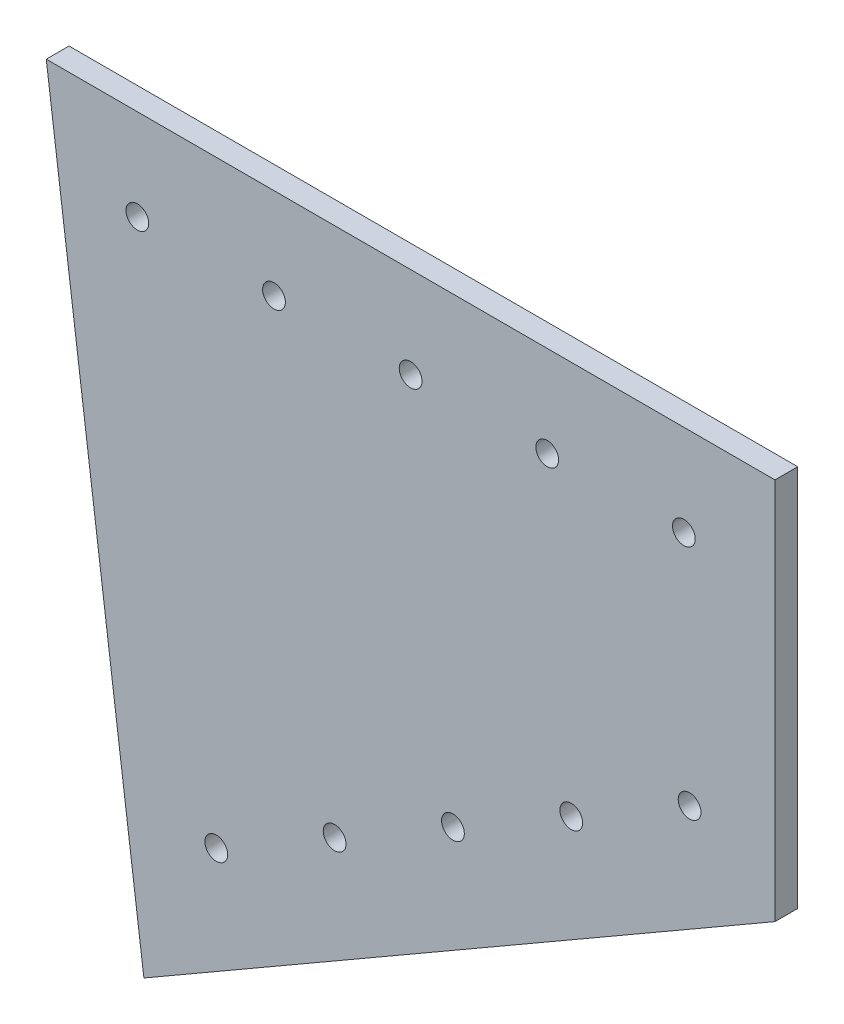
ISO-10303-21;
HEADER;
FILE_DESCRIPTION(('STEP AP214'),'2;1');
FILE_NAME('part.step','',(''),(''),'','','');
FILE_SCHEMA(('AUTOMOTIVE_DESIGN { 1 0 10303 214 1 1 1 1 }'));
ENDSEC;
DATA;
#1=APPLICATION_CONTEXT('core data for automotive mechanical design processes');
#2=APPLICATION_PROTOCOL_DEFINITION('international standard','automotive_design',2000,#1);
#3=PRODUCT_CONTEXT('',#1,'mechanical');
#4=PRODUCT('Part','Part','',(#3));
#5=PRODUCT_RELATED_PRODUCT_CATEGORY('part','',(#4));
#6=PRODUCT_DEFINITION_FORMATION('','',#4);
#7=PRODUCT_DEFINITION_CONTEXT('part definition',#1,'design');
#8=PRODUCT_DEFINITION('design','',#6,#7);
#9=PRODUCT_DEFINITION_SHAPE('','',#8);
#10=(LENGTH_UNIT() NAMED_UNIT(*) SI_UNIT(.MILLI.,.METRE.));
#11=(NAMED_UNIT(*) PLANE_ANGLE_UNIT() SI_UNIT($,.RADIAN.));
#12=(NAMED_UNIT(*) SI_UNIT($,.STERADIAN.) SOLID_ANGLE_UNIT());
#13=UNCERTAINTY_MEASURE_WITH_UNIT(LENGTH_MEASURE(1.E-05),#10,'distance_accuracy_value','');
#14=(GEOMETRIC_REPRESENTATION_CONTEXT(3) GLOBAL_UNCERTAINTY_ASSIGNED_CONTEXT((#13)) GLOBAL_UNIT_ASSIGNED_CONTEXT((#10,
#11,#12)) REPRESENTATION_CONTEXT('',''));
#15=CARTESIAN_POINT('',(0.,0.,0.));
#16=DIRECTION('',(0.,0.,1.));
#17=DIRECTION('',(1.,0.,0.));
#18=AXIS2_PLACEMENT_3D('',#15,#16,#17);
#19=CARTESIAN_POINT('',(0.,0.,3.175));
#20=DIRECTION('',(-0.500000000000001,0.866025403784438,0.));
#21=DIRECTION('',(-0.866025403784438,-0.500000000000001,0.));
#22=AXIS2_PLACEMENT_3D('',#19,#20,#21);
#23=PLANE('',#22);
#24=DIRECTION('',(0.866025403784438,0.500000000000001,0.));
#25=VECTOR('',#24,1.);
#26=CARTESIAN_POINT('',(0.,0.,0.));
#27=LINE('',#26,#25);
#28=CARTESIAN_POINT('',(-87.9881810244989,-50.8000000000001,0.));
#29=VERTEX_POINT('',#28);
#30=CARTESIAN_POINT('',(0.,0.,0.));
#31=VERTEX_POINT('',#30);
#32=EDGE_CURVE('E112',#29,#31,#27,.T.);
#33=ORIENTED_EDGE('',*,*,#32,.T.);
#34=DIRECTION('',(0.,0.,-1.));
#35=VECTOR('',#34,1.);
#36=CARTESIAN_POINT('',(0.,0.,3.175));
#37=LINE('',#36,#35);
#38=CARTESIAN_POINT('',(0.,0.,3.175));
#39=VERTEX_POINT('',#38);
#40=EDGE_CURVE('E11',#39,#31,#37,.T.);
#41=ORIENTED_EDGE('',*,*,#40,.F.);
#42=DIRECTION('',(0.866025403784438,0.500000000000001,0.));
#43=VECTOR('',#42,1.);
#44=CARTESIAN_POINT('',(0.,0.,3.175));
#45=LINE('',#44,#43);
#46=CARTESIAN_POINT('',(-87.9881810244989,-50.8000000000001,3.175));
#47=VERTEX_POINT('',#46);
#48=EDGE_CURVE('E95',#47,#39,#45,.T.);
#49=ORIENTED_EDGE('',*,*,#48,.F.);
#50=DIRECTION('',(0.,0.,-1.));
#51=VECTOR('',#50,1.);
#52=CARTESIAN_POINT('',(-87.9881810244989,-50.8000000000001,3.175));
#53=LINE('',#52,#51);
#54=EDGE_CURVE('E108',#47,#29,#53,.T.);
#55=ORIENTED_EDGE('',*,*,#54,.T.);
#56=EDGE_LOOP('',(#33,#41,#49,#55));
#57=FACE_BOUND('',#56,.T.);
#58=ADVANCED_FACE('F38',(#57),#23,.F.);
#59=CARTESIAN_POINT('',(0.,0.,3.175));
#60=DIRECTION('',(-1.,0.,0.));
#61=DIRECTION('',(0.,0.,1.));
#62=AXIS2_PLACEMENT_3D('',#59,#60,#61);
#63=PLANE('',#62);
#64=DIRECTION('',(0.,1.,0.));
#65=VECTOR('',#64,1.);
#66=CARTESIAN_POINT('',(0.,0.,0.));
#67=LINE('',#66,#65);
#68=CARTESIAN_POINT('',(0.,53.34,0.));
#69=VERTEX_POINT('',#68);
#70=EDGE_CURVE('E100',#31,#69,#67,.T.);
#71=ORIENTED_EDGE('',*,*,#70,.T.);
#72=DIRECTION('',(0.,0.,-1.));
#73=VECTOR('',#72,1.);
#74=CARTESIAN_POINT('',(0.,53.34,3.175));
#75=LINE('',#74,#73);
#76=CARTESIAN_POINT('',(0.,53.34,3.175));
#77=VERTEX_POINT('',#76);
#78=EDGE_CURVE('E47',#77,#69,#75,.T.);
#79=ORIENTED_EDGE('',*,*,#78,.F.);
#80=DIRECTION('',(0.,1.,0.));
#81=VECTOR('',#80,1.);
#82=CARTESIAN_POINT('',(0.,0.,3.175));
#83=LINE('',#82,#81);
#84=EDGE_CURVE('E90',#39,#77,#83,.T.);
#85=ORIENTED_EDGE('',*,*,#84,.F.);
#86=ORIENTED_EDGE('',*,*,#40,.T.);
#87=EDGE_LOOP('',(#71,#79,#85,#86));
#88=FACE_BOUND('',#87,.T.);
#89=ADVANCED_FACE('F99',(#88),#63,.F.);
#90=CARTESIAN_POINT('',(0.,53.34,3.175));
#91=DIRECTION('',(0.,-1.,0.));
#92=DIRECTION('',(1.,0.,0.));
#93=AXIS2_PLACEMENT_3D('',#90,#91,#92);
#94=PLANE('',#93);
#95=DIRECTION('',(-1.,0.,0.));
#96=VECTOR('',#95,1.);
#97=CARTESIAN_POINT('',(0.,53.34,0.));
#98=LINE('',#97,#96);
#99=CARTESIAN_POINT('',(-101.6,53.34,0.));
#100=VERTEX_POINT('',#99);
#101=EDGE_CURVE('E75',#69,#100,#98,.T.);
#102=ORIENTED_EDGE('',*,*,#101,.T.);
#103=DIRECTION('',(0.,0.,-1.));
#104=VECTOR('',#103,1.);
#105=CARTESIAN_POINT('',(-101.6,53.34,3.175));
#106=LINE('',#105,#104);
#107=CARTESIAN_POINT('',(-101.6,53.34,3.175));
#108=VERTEX_POINT('',#107);
#109=EDGE_CURVE('E102',#108,#100,#106,.T.);
#110=ORIENTED_EDGE('',*,*,#109,.F.);
#111=DIRECTION('',(-1.,0.,0.));
#112=VECTOR('',#111,1.);
#113=CARTESIAN_POINT('',(0.,53.34,3.175));
#114=LINE('',#113,#112);
#115=EDGE_CURVE('E93',#77,#108,#114,.T.);
#116=ORIENTED_EDGE('',*,*,#115,.F.);
#117=ORIENTED_EDGE('',*,*,#78,.T.);
#118=EDGE_LOOP('',(#102,#110,#116,#117));
#119=FACE_BOUND('',#118,.T.);
#120=ADVANCED_FACE('F103',(#119),#94,.F.);
#121=CARTESIAN_POINT('',(-87.9881810244989,-50.8000000000001,3.175));
#122=DIRECTION('',(0.991565767284408,0.129604510529856,0.));
#123=DIRECTION('',(-0.129604510529856,0.991565767284408,0.));
#124=AXIS2_PLACEMENT_3D('',#121,#122,#123);
#125=PLANE('',#124);
#126=DIRECTION('',(0.129604510529856,-0.991565767284408,0.));
#127=VECTOR('',#126,1.);
#128=CARTESIAN_POINT('',(-87.9881810244989,-50.8000000000001,0.));
#129=LINE('',#128,#127);
#130=EDGE_CURVE('E81',#100,#29,#129,.T.);
#131=ORIENTED_EDGE('',*,*,#130,.T.);
#132=ORIENTED_EDGE('',*,*,#54,.F.);
#133=DIRECTION('',(0.129604510529856,-0.991565767284408,0.));
#134=VECTOR('',#133,1.);
#135=CARTESIAN_POINT('',(-87.9881810244989,-50.8000000000001,3.175));
#136=LINE('',#135,#134);
#137=EDGE_CURVE('E58',#108,#47,#136,.T.);
#138=ORIENTED_EDGE('',*,*,#137,.F.);
#139=ORIENTED_EDGE('',*,*,#109,.T.);
#140=EDGE_LOOP('',(#131,#132,#138,#139));
#141=FACE_BOUND('',#140,.T.);
#142=ADVANCED_FACE('F124',(#141),#125,.F.);
#143=CARTESIAN_POINT('',(0.,0.,3.175));
#144=DIRECTION('',(0.,0.,-1.));
#145=DIRECTION('',(-1.,0.,0.));
#146=AXIS2_PLACEMENT_3D('',#143,#144,#145);
#147=PLANE('',#146);
#148=CARTESIAN_POINT('',(-31.75,40.64,3.175));
#149=DIRECTION('',(0.,0.,-1.));
#150=DIRECTION('',(-1.,0.,0.));
#151=AXIS2_PLACEMENT_3D('',#148,#149,#150);
#152=CIRCLE('',#151,1.5875);
#153=CARTESIAN_POINT('',(-33.3375,40.64,3.175));
#154=VERTEX_POINT('',#153);
#155=EDGE_CURVE('E139',#154,#154,#152,.F.);
#156=ORIENTED_EDGE('',*,*,#155,.F.);
#157=EDGE_LOOP('',(#156));
#158=FACE_BOUND('',#157,.T.);
#159=CARTESIAN_POINT('',(-50.8,40.64,3.175));
#160=DIRECTION('',(0.,0.,-1.));
#161=DIRECTION('',(-1.,0.,0.));
#162=AXIS2_PLACEMENT_3D('',#159,#160,#161);
#163=CIRCLE('',#162,1.5875);
#164=CARTESIAN_POINT('',(-52.3875,40.64,3.175));
#165=VERTEX_POINT('',#164);
#166=EDGE_CURVE('E196',#165,#165,#163,.F.);
#167=ORIENTED_EDGE('',*,*,#166,.F.);
#168=EDGE_LOOP('',(#167));
#169=FACE_BOUND('',#168,.T.);
#170=CARTESIAN_POINT('',(-69.85,40.64,3.175));
#171=DIRECTION('',(0.,0.,-1.));
#172=DIRECTION('',(-1.,0.,0.));
#173=AXIS2_PLACEMENT_3D('',#170,#171,#172);
#174=CIRCLE('',#173,1.5875);
#175=CARTESIAN_POINT('',(-71.4375,40.64,3.175));
#176=VERTEX_POINT('',#175);
#177=EDGE_CURVE('E188',#176,#176,#174,.F.);
#178=ORIENTED_EDGE('',*,*,#177,.F.);
#179=EDGE_LOOP('',(#178));
#180=FACE_BOUND('',#179,.T.);
#181=CARTESIAN_POINT('',(-88.9,40.64,3.175));
#182=DIRECTION('',(0.,0.,-1.));
#183=DIRECTION('',(-1.,0.,0.));
#184=AXIS2_PLACEMENT_3D('',#181,#182,#183);
#185=CIRCLE('',#184,1.5875);
#186=CARTESIAN_POINT('',(-90.4875,40.64,3.175));
#187=VERTEX_POINT('',#186);
#188=EDGE_CURVE('E180',#187,#187,#185,.F.);
#189=ORIENTED_EDGE('',*,*,#188,.F.);
#190=EDGE_LOOP('',(#189));
#191=FACE_BOUND('',#190,.T.);
#192=CARTESIAN_POINT('',(-11.9038807437582,8.02596294777846,3.175));
#193=DIRECTION('',(0.,0.,-1.));
#194=DIRECTION('',(-1.,0.,0.));
#195=AXIS2_PLACEMENT_3D('',#192,#193,#194);
#196=CIRCLE('',#195,1.5875);
#197=CARTESIAN_POINT('',(-13.4913807437582,8.02596294777846,3.175));
#198=VERTEX_POINT('',#197);
#199=EDGE_CURVE('E172',#198,#198,#196,.F.);
#200=ORIENTED_EDGE('',*,*,#199,.F.);
#201=EDGE_LOOP('',(#200));
#202=FACE_BOUND('',#201,.T.);
#203=CARTESIAN_POINT('',(-28.4016646858517,-1.49903705222156,3.175));
#204=DIRECTION('',(0.,0.,-1.));
#205=DIRECTION('',(-1.,0.,0.));
#206=AXIS2_PLACEMENT_3D('',#203,#204,#205);
#207=CIRCLE('',#206,1.5875);
#208=CARTESIAN_POINT('',(-29.9891646858517,-1.49903705222156,3.175));
#209=VERTEX_POINT('',#208);
#210=EDGE_CURVE('E165',#209,#209,#207,.F.);
#211=ORIENTED_EDGE('',*,*,#210,.F.);
#212=EDGE_LOOP('',(#211));
#213=FACE_BOUND('',#212,.T.);
#214=CARTESIAN_POINT('',(-44.8994486279453,-11.0240370522216,3.175));
#215=DIRECTION('',(0.,0.,-1.));
#216=DIRECTION('',(-1.,0.,0.));
#217=AXIS2_PLACEMENT_3D('',#214,#215,#216);
#218=CIRCLE('',#217,1.5875);
#219=CARTESIAN_POINT('',(-46.4869486279453,-11.0240370522216,3.175));
#220=VERTEX_POINT('',#219);
#221=EDGE_CURVE('E157',#220,#220,#218,.F.);
#222=ORIENTED_EDGE('',*,*,#221,.F.);
#223=EDGE_LOOP('',(#222));
#224=FACE_BOUND('',#223,.T.);
#225=CARTESIAN_POINT('',(-61.3972325700388,-20.5490370522216,3.175));
#226=DIRECTION('',(0.,0.,-1.));
#227=DIRECTION('',(-1.,0.,0.));
#228=AXIS2_PLACEMENT_3D('',#225,#226,#227);
#229=CIRCLE('',#228,1.58749999999999);
#230=CARTESIAN_POINT('',(-62.9847325700388,-20.5490370522216,3.175));
#231=VERTEX_POINT('',#230);
#232=EDGE_CURVE('E149',#231,#231,#229,.F.);
#233=ORIENTED_EDGE('',*,*,#232,.F.);
#234=EDGE_LOOP('',(#233));
#235=FACE_BOUND('',#234,.T.);
#236=CARTESIAN_POINT('',(-77.8950165121323,-30.0740370522216,3.175));
#237=DIRECTION('',(0.,0.,-1.));
#238=DIRECTION('',(-1.,0.,0.));
#239=AXIS2_PLACEMENT_3D('',#236,#237,#238);
#240=CIRCLE('',#239,1.5875);
#241=CARTESIAN_POINT('',(-79.4825165121323,-30.0740370522216,3.175));
#242=VERTEX_POINT('',#241);
#243=EDGE_CURVE('E140',#242,#242,#240,.F.);
#244=ORIENTED_EDGE('',*,*,#243,.F.);
#245=EDGE_LOOP('',(#244));
#246=FACE_BOUND('',#245,.T.);
#247=CARTESIAN_POINT('',(-12.7,40.64,3.175));
#248=DIRECTION('',(0.,0.,-1.));
#249=DIRECTION('',(-1.,0.,0.));
#250=AXIS2_PLACEMENT_3D('',#247,#248,#249);
#251=CIRCLE('',#250,1.5875);
#252=CARTESIAN_POINT('',(-14.2875,40.64,3.175));
#253=VERTEX_POINT('',#252);
#254=EDGE_CURVE('E116',#253,#253,#251,.F.);
#255=ORIENTED_EDGE('',*,*,#254,.F.);
#256=EDGE_LOOP('',(#255));
#257=FACE_BOUND('',#256,.T.);
#258=ORIENTED_EDGE('',*,*,#48,.T.);
#259=ORIENTED_EDGE('',*,*,#84,.T.);
#260=ORIENTED_EDGE('',*,*,#115,.T.);
#261=ORIENTED_EDGE('',*,*,#137,.T.);
#262=EDGE_LOOP('',(#258,#259,#260,#261));
#263=FACE_BOUND('',#262,.T.);
#264=ADVANCED_FACE('F91',(#158,#169,#180,#191,#202,#213,#224,#235,#246,#257,#263),#147,.F.);
#265=CARTESIAN_POINT('',(0.,0.,0.));
#266=DIRECTION('',(0.,0.,-1.));
#267=DIRECTION('',(-1.,0.,0.));
#268=AXIS2_PLACEMENT_3D('',#265,#266,#267);
#269=PLANE('',#268);
#270=CARTESIAN_POINT('',(-31.75,40.64,0.));
#271=DIRECTION('',(0.,0.,-1.));
#272=DIRECTION('',(-1.,0.,0.));
#273=AXIS2_PLACEMENT_3D('',#270,#271,#272);
#274=CIRCLE('',#273,1.5875);
#275=CARTESIAN_POINT('',(-33.3375,40.64,0.));
#276=VERTEX_POINT('',#275);
#277=EDGE_CURVE('E200',#276,#276,#274,.T.);
#278=ORIENTED_EDGE('',*,*,#277,.F.);
#279=EDGE_LOOP('',(#278));
#280=FACE_BOUND('',#279,.T.);
#281=CARTESIAN_POINT('',(-50.8,40.64,0.));
#282=DIRECTION('',(0.,0.,-1.));
#283=DIRECTION('',(-1.,0.,0.));
#284=AXIS2_PLACEMENT_3D('',#281,#282,#283);
#285=CIRCLE('',#284,1.5875);
#286=CARTESIAN_POINT('',(-52.3875,40.64,0.));
#287=VERTEX_POINT('',#286);
#288=EDGE_CURVE('E192',#287,#287,#285,.T.);
#289=ORIENTED_EDGE('',*,*,#288,.F.);
#290=EDGE_LOOP('',(#289));
#291=FACE_BOUND('',#290,.T.);
#292=CARTESIAN_POINT('',(-69.85,40.64,0.));
#293=DIRECTION('',(0.,0.,-1.));
#294=DIRECTION('',(-1.,0.,0.));
#295=AXIS2_PLACEMENT_3D('',#292,#293,#294);
#296=CIRCLE('',#295,1.5875);
#297=CARTESIAN_POINT('',(-71.4375,40.64,0.));
#298=VERTEX_POINT('',#297);
#299=EDGE_CURVE('E184',#298,#298,#296,.T.);
#300=ORIENTED_EDGE('',*,*,#299,.F.);
#301=EDGE_LOOP('',(#300));
#302=FACE_BOUND('',#301,.T.);
#303=CARTESIAN_POINT('',(-88.9,40.64,0.));
#304=DIRECTION('',(0.,0.,-1.));
#305=DIRECTION('',(-1.,0.,0.));
#306=AXIS2_PLACEMENT_3D('',#303,#304,#305);
#307=CIRCLE('',#306,1.5875);
#308=CARTESIAN_POINT('',(-90.4875,40.64,0.));
#309=VERTEX_POINT('',#308);
#310=EDGE_CURVE('E176',#309,#309,#307,.T.);
#311=ORIENTED_EDGE('',*,*,#310,.F.);
#312=EDGE_LOOP('',(#311));
#313=FACE_BOUND('',#312,.T.);
#314=CARTESIAN_POINT('',(-11.9038807437582,8.02596294777846,0.));
#315=DIRECTION('',(0.,0.,-1.));
#316=DIRECTION('',(-1.,0.,0.));
#317=AXIS2_PLACEMENT_3D('',#314,#315,#316);
#318=CIRCLE('',#317,1.5875);
#319=CARTESIAN_POINT('',(-13.4913807437582,8.02596294777846,0.));
#320=VERTEX_POINT('',#319);
#321=EDGE_CURVE('E169',#320,#320,#318,.T.);
#322=ORIENTED_EDGE('',*,*,#321,.F.);
#323=EDGE_LOOP('',(#322));
#324=FACE_BOUND('',#323,.T.);
#325=CARTESIAN_POINT('',(-28.4016646858517,-1.49903705222156,0.));
#326=DIRECTION('',(0.,0.,-1.));
#327=DIRECTION('',(-1.,0.,0.));
#328=AXIS2_PLACEMENT_3D('',#325,#326,#327);
#329=CIRCLE('',#328,1.5875);
#330=CARTESIAN_POINT('',(-29.9891646858517,-1.49903705222156,0.));
#331=VERTEX_POINT('',#330);
#332=EDGE_CURVE('E161',#331,#331,#329,.T.);
#333=ORIENTED_EDGE('',*,*,#332,.F.);
#334=EDGE_LOOP('',(#333));
#335=FACE_BOUND('',#334,.T.);
#336=CARTESIAN_POINT('',(-44.8994486279453,-11.0240370522216,0.));
#337=DIRECTION('',(0.,0.,-1.));
#338=DIRECTION('',(-1.,0.,0.));
#339=AXIS2_PLACEMENT_3D('',#336,#337,#338);
#340=CIRCLE('',#339,1.5875);
#341=CARTESIAN_POINT('',(-46.4869486279453,-11.0240370522216,0.));
#342=VERTEX_POINT('',#341);
#343=EDGE_CURVE('E153',#342,#342,#340,.T.);
#344=ORIENTED_EDGE('',*,*,#343,.F.);
#345=EDGE_LOOP('',(#344));
#346=FACE_BOUND('',#345,.T.);
#347=CARTESIAN_POINT('',(-61.3972325700388,-20.5490370522216,0.));
#348=DIRECTION('',(0.,0.,-1.));
#349=DIRECTION('',(-1.,0.,0.));
#350=AXIS2_PLACEMENT_3D('',#347,#348,#349);
#351=CIRCLE('',#350,1.58749999999999);
#352=CARTESIAN_POINT('',(-62.9847325700388,-20.5490370522216,0.));
#353=VERTEX_POINT('',#352);
#354=EDGE_CURVE('E144',#353,#353,#351,.T.);
#355=ORIENTED_EDGE('',*,*,#354,.F.);
#356=EDGE_LOOP('',(#355));
#357=FACE_BOUND('',#356,.T.);
#358=CARTESIAN_POINT('',(-77.8950165121323,-30.0740370522216,0.));
#359=DIRECTION('',(0.,0.,-1.));
#360=DIRECTION('',(-1.,0.,0.));
#361=AXIS2_PLACEMENT_3D('',#358,#359,#360);
#362=CIRCLE('',#361,1.5875);
#363=CARTESIAN_POINT('',(-79.4825165121323,-30.0740370522216,0.));
#364=VERTEX_POINT('',#363);
#365=EDGE_CURVE('E145',#364,#364,#362,.T.);
#366=ORIENTED_EDGE('',*,*,#365,.F.);
#367=EDGE_LOOP('',(#366));
#368=FACE_BOUND('',#367,.T.);
#369=CARTESIAN_POINT('',(-12.7,40.64,0.));
#370=DIRECTION('',(0.,0.,-1.));
#371=DIRECTION('',(-1.,0.,0.));
#372=AXIS2_PLACEMENT_3D('',#369,#370,#371);
#373=CIRCLE('',#372,1.5875);
#374=CARTESIAN_POINT('',(-14.2875,40.64,0.));
#375=VERTEX_POINT('',#374);
#376=EDGE_CURVE('E135',#375,#375,#373,.T.);
#377=ORIENTED_EDGE('',*,*,#376,.F.);
#378=EDGE_LOOP('',(#377));
#379=FACE_BOUND('',#378,.T.);
#380=ORIENTED_EDGE('',*,*,#32,.F.);
#381=ORIENTED_EDGE('',*,*,#130,.F.);
#382=ORIENTED_EDGE('',*,*,#101,.F.);
#383=ORIENTED_EDGE('',*,*,#70,.F.);
#384=EDGE_LOOP('',(#380,#381,#382,#383));
#385=FACE_BOUND('',#384,.T.);
#386=ADVANCED_FACE('F127',(#280,#291,#302,#313,#324,#335,#346,#357,#368,#379,#385),#269,.T.);
#387=CARTESIAN_POINT('',(-12.7,40.64,3.176));
#388=DIRECTION('',(0.,0.,-1.));
#389=DIRECTION('',(-1.,0.,0.));
#390=AXIS2_PLACEMENT_3D('',#387,#388,#389);
#391=CYLINDRICAL_SURFACE('',#390,1.5875);
#392=ORIENTED_EDGE('',*,*,#376,.T.);
#393=EDGE_LOOP('',(#392));
#394=FACE_BOUND('',#393,.T.);
#395=ORIENTED_EDGE('',*,*,#254,.T.);
#396=EDGE_LOOP('',(#395));
#397=FACE_BOUND('',#396,.T.);
#398=ADVANCED_FACE('F216',(#394,#397),#391,.F.);
#399=CARTESIAN_POINT('',(-77.8950165121323,-30.0740370522216,3.176));
#400=DIRECTION('',(0.,0.,-1.));
#401=DIRECTION('',(-1.,0.,0.));
#402=AXIS2_PLACEMENT_3D('',#399,#400,#401);
#403=CYLINDRICAL_SURFACE('',#402,1.5875);
#404=ORIENTED_EDGE('',*,*,#365,.T.);
#405=EDGE_LOOP('',(#404));
#406=FACE_BOUND('',#405,.T.);
#407=ORIENTED_EDGE('',*,*,#243,.T.);
#408=EDGE_LOOP('',(#407));
#409=FACE_BOUND('',#408,.T.);
#410=ADVANCED_FACE('F238',(#406,#409),#403,.F.);
#411=CARTESIAN_POINT('',(-61.3972325700388,-20.5490370522216,3.176));
#412=DIRECTION('',(0.,0.,-1.));
#413=DIRECTION('',(-1.,0.,0.));
#414=AXIS2_PLACEMENT_3D('',#411,#412,#413);
#415=CYLINDRICAL_SURFACE('',#414,1.58749999999999);
#416=ORIENTED_EDGE('',*,*,#354,.T.);
#417=EDGE_LOOP('',(#416));
#418=FACE_BOUND('',#417,.T.);
#419=ORIENTED_EDGE('',*,*,#232,.T.);
#420=EDGE_LOOP('',(#419));
#421=FACE_BOUND('',#420,.T.);
#422=ADVANCED_FACE('F291',(#418,#421),#415,.F.);
#423=CARTESIAN_POINT('',(-44.8994486279453,-11.0240370522216,3.176));
#424=DIRECTION('',(0.,0.,-1.));
#425=DIRECTION('',(-1.,0.,0.));
#426=AXIS2_PLACEMENT_3D('',#423,#424,#425);
#427=CYLINDRICAL_SURFACE('',#426,1.5875);
#428=ORIENTED_EDGE('',*,*,#343,.T.);
#429=EDGE_LOOP('',(#428));
#430=FACE_BOUND('',#429,.T.);
#431=ORIENTED_EDGE('',*,*,#221,.T.);
#432=EDGE_LOOP('',(#431));
#433=FACE_BOUND('',#432,.T.);
#434=ADVANCED_FACE('F301',(#430,#433),#427,.F.);
#435=CARTESIAN_POINT('',(-28.4016646858517,-1.49903705222156,3.176));
#436=DIRECTION('',(0.,0.,-1.));
#437=DIRECTION('',(-1.,0.,0.));
#438=AXIS2_PLACEMENT_3D('',#435,#436,#437);
#439=CYLINDRICAL_SURFACE('',#438,1.5875);
#440=ORIENTED_EDGE('',*,*,#332,.T.);
#441=EDGE_LOOP('',(#440));
#442=FACE_BOUND('',#441,.T.);
#443=ORIENTED_EDGE('',*,*,#210,.T.);
#444=EDGE_LOOP('',(#443));
#445=FACE_BOUND('',#444,.T.);
#446=ADVANCED_FACE('F311',(#442,#445),#439,.F.);
#447=CARTESIAN_POINT('',(-11.9038807437582,8.02596294777846,3.176));
#448=DIRECTION('',(0.,0.,-1.));
#449=DIRECTION('',(-1.,0.,0.));
#450=AXIS2_PLACEMENT_3D('',#447,#448,#449);
#451=CYLINDRICAL_SURFACE('',#450,1.5875);
#452=ORIENTED_EDGE('',*,*,#321,.T.);
#453=EDGE_LOOP('',(#452));
#454=FACE_BOUND('',#453,.T.);
#455=ORIENTED_EDGE('',*,*,#199,.T.);
#456=EDGE_LOOP('',(#455));
#457=FACE_BOUND('',#456,.T.);
#458=ADVANCED_FACE('F321',(#454,#457),#451,.F.);
#459=CARTESIAN_POINT('',(-88.9,40.64,3.176));
#460=DIRECTION('',(0.,0.,-1.));
#461=DIRECTION('',(-1.,0.,0.));
#462=AXIS2_PLACEMENT_3D('',#459,#460,#461);
#463=CYLINDRICAL_SURFACE('',#462,1.5875);
#464=ORIENTED_EDGE('',*,*,#310,.T.);
#465=EDGE_LOOP('',(#464));
#466=FACE_BOUND('',#465,.T.);
#467=ORIENTED_EDGE('',*,*,#188,.T.);
#468=EDGE_LOOP('',(#467));
#469=FACE_BOUND('',#468,.T.);
#470=ADVANCED_FACE('F331',(#466,#469),#463,.F.);
#471=CARTESIAN_POINT('',(-69.85,40.64,3.176));
#472=DIRECTION('',(0.,0.,-1.));
#473=DIRECTION('',(-1.,0.,0.));
#474=AXIS2_PLACEMENT_3D('',#471,#472,#473);
#475=CYLINDRICAL_SURFACE('',#474,1.5875);
#476=ORIENTED_EDGE('',*,*,#299,.T.);
#477=EDGE_LOOP('',(#476));
#478=FACE_BOUND('',#477,.T.);
#479=ORIENTED_EDGE('',*,*,#177,.T.);
#480=EDGE_LOOP('',(#479));
#481=FACE_BOUND('',#480,.T.);
#482=ADVANCED_FACE('F341',(#478,#481),#475,.F.);
#483=CARTESIAN_POINT('',(-50.8,40.64,3.176));
#484=DIRECTION('',(0.,0.,-1.));
#485=DIRECTION('',(-1.,0.,0.));
#486=AXIS2_PLACEMENT_3D('',#483,#484,#485);
#487=CYLINDRICAL_SURFACE('',#486,1.5875);
#488=ORIENTED_EDGE('',*,*,#288,.T.);
#489=EDGE_LOOP('',(#488));
#490=FACE_BOUND('',#489,.T.);
#491=ORIENTED_EDGE('',*,*,#166,.T.);
#492=EDGE_LOOP('',(#491));
#493=FACE_BOUND('',#492,.T.);
#494=ADVANCED_FACE('F351',(#490,#493),#487,.F.);
#495=CARTESIAN_POINT('',(-31.75,40.64,3.176));
#496=DIRECTION('',(0.,0.,-1.));
#497=DIRECTION('',(-1.,0.,0.));
#498=AXIS2_PLACEMENT_3D('',#495,#496,#497);
#499=CYLINDRICAL_SURFACE('',#498,1.5875);
#500=ORIENTED_EDGE('',*,*,#277,.T.);
#501=EDGE_LOOP('',(#500));
#502=FACE_BOUND('',#501,.T.);
#503=ORIENTED_EDGE('',*,*,#155,.T.);
#504=EDGE_LOOP('',(#503));
#505=FACE_BOUND('',#504,.T.);
#506=ADVANCED_FACE('F211',(#502,#505),#499,.F.);
#507=CLOSED_SHELL('',(#58,#89,#120,#142,#264,#386,#398,#410,#422,#434,#446,#458,#470,#482,#494,#506));
#508=MANIFOLD_SOLID_BREP('B2',#507);
#509=ADVANCED_BREP_SHAPE_REPRESENTATION('',(#18,#508),#14);
#510=SHAPE_DEFINITION_REPRESENTATION(#9,#509);
ENDSEC;
END-ISO-10303-21;
